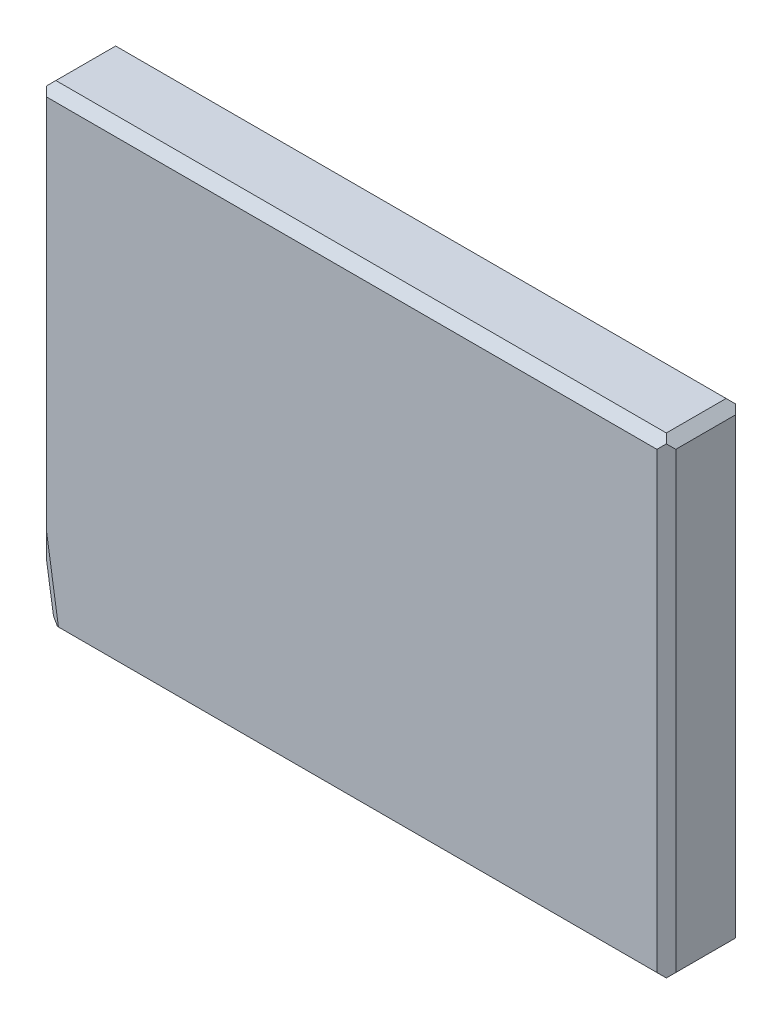
ISO-10303-21;
HEADER;
FILE_DESCRIPTION(('STEP AP214'),'2;1');
FILE_NAME('part.step','',(''),(''),'','','');
FILE_SCHEMA(('AUTOMOTIVE_DESIGN { 1 0 10303 214 1 1 1 1 }'));
ENDSEC;
DATA;
#1=APPLICATION_CONTEXT('core data for automotive mechanical design processes');
#2=APPLICATION_PROTOCOL_DEFINITION('international standard','automotive_design',2000,#1);
#3=PRODUCT_CONTEXT('',#1,'mechanical');
#4=PRODUCT('Part','Part','',(#3));
#5=PRODUCT_RELATED_PRODUCT_CATEGORY('part','',(#4));
#6=PRODUCT_DEFINITION_FORMATION('','',#4);
#7=PRODUCT_DEFINITION_CONTEXT('part definition',#1,'design');
#8=PRODUCT_DEFINITION('design','',#6,#7);
#9=PRODUCT_DEFINITION_SHAPE('','',#8);
#10=(LENGTH_UNIT() NAMED_UNIT(*) SI_UNIT(.MILLI.,.METRE.));
#11=(NAMED_UNIT(*) PLANE_ANGLE_UNIT() SI_UNIT($,.RADIAN.));
#12=(NAMED_UNIT(*) SI_UNIT($,.STERADIAN.) SOLID_ANGLE_UNIT());
#13=UNCERTAINTY_MEASURE_WITH_UNIT(LENGTH_MEASURE(1.E-05),#10,'distance_accuracy_value','');
#14=(GEOMETRIC_REPRESENTATION_CONTEXT(3) GLOBAL_UNCERTAINTY_ASSIGNED_CONTEXT((#13)) GLOBAL_UNIT_ASSIGNED_CONTEXT((#10,
#11,#12)) REPRESENTATION_CONTEXT('',''));
#15=CARTESIAN_POINT('',(0.,0.,0.));
#16=DIRECTION('',(0.,0.,1.));
#17=DIRECTION('',(1.,0.,0.));
#18=AXIS2_PLACEMENT_3D('',#15,#16,#17);
#19=CARTESIAN_POINT('',(0.,0.,12.7));
#20=DIRECTION('',(1.,0.,0.));
#21=DIRECTION('',(0.,0.,-1.));
#22=AXIS2_PLACEMENT_3D('',#19,#20,#21);
#23=PLANE('',#22);
#24=DIRECTION('',(0.,0.,-1.));
#25=VECTOR('',#24,1.);
#26=CARTESIAN_POINT('',(0.,74.676,12.7));
#27=LINE('',#26,#25);
#28=CARTESIAN_POINT('',(0.,74.676,11.176));
#29=VERTEX_POINT('',#28);
#30=CARTESIAN_POINT('',(0.,74.676,1.52399999999998));
#31=VERTEX_POINT('',#30);
#32=EDGE_CURVE('E282',#29,#31,#27,.T.);
#33=ORIENTED_EDGE('',*,*,#32,.T.);
#34=DIRECTION('',(0.,-1.,0.));
#35=VECTOR('',#34,1.);
#36=CARTESIAN_POINT('',(0.,74.1556019661523,1.52399999999998));
#37=LINE('',#36,#35);
#38=CARTESIAN_POINT('',(0.,58.6875531269975,1.52399999999998));
#39=VERTEX_POINT('',#38);
#40=EDGE_CURVE('E370',#31,#39,#37,.T.);
#41=ORIENTED_EDGE('',*,*,#40,.T.);
#42=DIRECTION('',(0.,-0.995181398878501,0.098050922108007));
#43=VECTOR('',#42,1.);
#44=CARTESIAN_POINT('',(0.,9.26744744054077,6.39314942209829));
#45=LINE('',#44,#43);
#46=CARTESIAN_POINT('',(0.,2.86391773399458,7.02406152835393));
#47=VERTEX_POINT('',#46);
#48=EDGE_CURVE('E246',#39,#47,#45,.T.);
#49=ORIENTED_EDGE('',*,*,#48,.T.);
#50=DIRECTION('',(0.,0.816496580927724,0.577350269189629));
#51=VECTOR('',#50,1.);
#52=CARTESIAN_POINT('',(0.,6.08314327930163,9.30039774160953));
#53=LINE('',#52,#51);
#54=CARTESIAN_POINT('',(0.,8.73564543073502,11.176));
#55=VERTEX_POINT('',#54);
#56=EDGE_CURVE('E229',#47,#55,#53,.T.);
#57=ORIENTED_EDGE('',*,*,#56,.T.);
#58=DIRECTION('',(0.,1.,0.));
#59=VECTOR('',#58,1.);
#60=CARTESIAN_POINT('',(0.,0.,11.176));
#61=LINE('',#60,#59);
#62=EDGE_CURVE('E333',#55,#29,#61,.T.);
#63=ORIENTED_EDGE('',*,*,#62,.T.);
#64=EDGE_LOOP('',(#33,#41,#49,#57,#63));
#65=FACE_BOUND('',#64,.T.);
#66=ADVANCED_FACE('F41',(#65),#23,.F.);
#67=CARTESIAN_POINT('',(0.,0.,12.7));
#68=DIRECTION('',(0.,1.,0.));
#69=DIRECTION('',(0.,0.,1.));
#70=AXIS2_PLACEMENT_3D('',#67,#68,#69);
#71=PLANE('',#70);
#72=DIRECTION('',(0.816496580927723,0.,-0.57735026918963));
#73=VECTOR('',#72,1.);
#74=CARTESIAN_POINT('',(6.08314327930157,0.,3.39960225839039));
#75=LINE('',#74,#73);
#76=CARTESIAN_POINT('',(1.91065077872253,0.,6.34999999999987));
#77=VERTEX_POINT('',#76);
#78=CARTESIAN_POINT('',(8.73564543073486,0.,1.52399999999998));
#79=VERTEX_POINT('',#78);
#80=EDGE_CURVE('E450',#77,#79,#75,.T.);
#81=ORIENTED_EDGE('',*,*,#80,.T.);
#82=DIRECTION('',(1.,0.,0.));
#83=VECTOR('',#82,1.);
#84=CARTESIAN_POINT('',(100.076,0.,1.52399999999998));
#85=LINE('',#84,#83);
#86=CARTESIAN_POINT('',(100.076,0.,1.52399999999998));
#87=VERTEX_POINT('',#86);
#88=EDGE_CURVE('E359',#79,#87,#85,.T.);
#89=ORIENTED_EDGE('',*,*,#88,.T.);
#90=DIRECTION('',(0.,0.,1.));
#91=VECTOR('',#90,1.);
#92=CARTESIAN_POINT('',(100.076,0.,12.7));
#93=LINE('',#92,#91);
#94=CARTESIAN_POINT('',(100.076,0.,11.176));
#95=VERTEX_POINT('',#94);
#96=EDGE_CURVE('E272',#87,#95,#93,.T.);
#97=ORIENTED_EDGE('',*,*,#96,.T.);
#98=DIRECTION('',(-1.,0.,0.));
#99=VECTOR('',#98,1.);
#100=CARTESIAN_POINT('',(0.,0.,11.176));
#101=LINE('',#100,#99);
#102=CARTESIAN_POINT('',(8.73564543073516,0.,11.176));
#103=VERTEX_POINT('',#102);
#104=EDGE_CURVE('E317',#95,#103,#101,.T.);
#105=ORIENTED_EDGE('',*,*,#104,.T.);
#106=DIRECTION('',(-0.816496580927721,0.,-0.577350269189633));
#107=VECTOR('',#106,1.);
#108=CARTESIAN_POINT('',(3.92788181024508,0.,7.77639774160943));
#109=LINE('',#108,#107);
#110=EDGE_CURVE('E256',#103,#77,#109,.T.);
#111=ORIENTED_EDGE('',*,*,#110,.T.);
#112=EDGE_LOOP('',(#81,#89,#97,#105,#111));
#113=FACE_BOUND('',#112,.T.);
#114=ADVANCED_FACE('F452',(#113),#71,.F.);
#115=CARTESIAN_POINT('',(101.6,0.,12.7));
#116=DIRECTION('',(-1.,0.,0.));
#117=DIRECTION('',(0.,0.,1.));
#118=AXIS2_PLACEMENT_3D('',#115,#116,#117);
#119=PLANE('',#118);
#120=DIRECTION('',(0.,0.,-1.));
#121=VECTOR('',#120,1.);
#122=CARTESIAN_POINT('',(101.6,1.52399999999998,12.7));
#123=LINE('',#122,#121);
#124=CARTESIAN_POINT('',(101.6,1.52399999999998,11.176));
#125=VERTEX_POINT('',#124);
#126=CARTESIAN_POINT('',(101.6,1.52399999999998,1.52399999999998));
#127=VERTEX_POINT('',#126);
#128=EDGE_CURVE('E271',#125,#127,#123,.T.);
#129=ORIENTED_EDGE('',*,*,#128,.T.);
#130=DIRECTION('',(0.,1.,0.));
#131=VECTOR('',#130,1.);
#132=CARTESIAN_POINT('',(101.6,74.676,1.52399999999998));
#133=LINE('',#132,#131);
#134=CARTESIAN_POINT('',(101.6,74.676,1.52399999999998));
#135=VERTEX_POINT('',#134);
#136=EDGE_CURVE('E346',#127,#135,#133,.T.);
#137=ORIENTED_EDGE('',*,*,#136,.T.);
#138=DIRECTION('',(0.,0.,1.));
#139=VECTOR('',#138,1.);
#140=CARTESIAN_POINT('',(101.6,74.676,12.7));
#141=LINE('',#140,#139);
#142=CARTESIAN_POINT('',(101.6,74.676,11.176));
#143=VERTEX_POINT('',#142);
#144=EDGE_CURVE('E278',#135,#143,#141,.T.);
#145=ORIENTED_EDGE('',*,*,#144,.T.);
#146=DIRECTION('',(0.,-1.,0.));
#147=VECTOR('',#146,1.);
#148=CARTESIAN_POINT('',(101.6,0.,11.176));
#149=LINE('',#148,#147);
#150=EDGE_CURVE('E303',#143,#125,#149,.T.);
#151=ORIENTED_EDGE('',*,*,#150,.T.);
#152=EDGE_LOOP('',(#129,#137,#145,#151));
#153=FACE_BOUND('',#152,.T.);
#154=ADVANCED_FACE('F456',(#153),#119,.F.);
#155=CARTESIAN_POINT('',(0.,76.2,12.7));
#156=DIRECTION('',(0.,-1.,0.));
#157=DIRECTION('',(0.,0.,-1.));
#158=AXIS2_PLACEMENT_3D('',#155,#156,#157);
#159=PLANE('',#158);
#160=DIRECTION('',(0.,0.,-1.));
#161=VECTOR('',#160,1.);
#162=CARTESIAN_POINT('',(100.076,76.2,12.7));
#163=LINE('',#162,#161);
#164=CARTESIAN_POINT('',(100.076,76.2,11.176));
#165=VERTEX_POINT('',#164);
#166=CARTESIAN_POINT('',(100.076,76.2,1.52399999999998));
#167=VERTEX_POINT('',#166);
#168=EDGE_CURVE('E276',#165,#167,#163,.T.);
#169=ORIENTED_EDGE('',*,*,#168,.T.);
#170=DIRECTION('',(-1.,0.,0.));
#171=VECTOR('',#170,1.);
#172=CARTESIAN_POINT('',(1.52400000000001,76.2,1.52399999999998));
#173=LINE('',#172,#171);
#174=CARTESIAN_POINT('',(1.52400000000001,76.2,1.52399999999998));
#175=VERTEX_POINT('',#174);
#176=EDGE_CURVE('E340',#167,#175,#173,.T.);
#177=ORIENTED_EDGE('',*,*,#176,.T.);
#178=DIRECTION('',(0.,0.,1.));
#179=VECTOR('',#178,1.);
#180=CARTESIAN_POINT('',(1.52400000000001,76.2,12.7));
#181=LINE('',#180,#179);
#182=CARTESIAN_POINT('',(1.52400000000001,76.2,11.176));
#183=VERTEX_POINT('',#182);
#184=EDGE_CURVE('E281',#175,#183,#181,.T.);
#185=ORIENTED_EDGE('',*,*,#184,.T.);
#186=DIRECTION('',(1.,0.,0.));
#187=VECTOR('',#186,1.);
#188=CARTESIAN_POINT('',(0.,76.2,11.176));
#189=LINE('',#188,#187);
#190=EDGE_CURVE('E292',#183,#165,#189,.T.);
#191=ORIENTED_EDGE('',*,*,#190,.T.);
#192=EDGE_LOOP('',(#169,#177,#185,#191));
#193=FACE_BOUND('',#192,.T.);
#194=ADVANCED_FACE('F407',(#193),#159,.F.);
#195=CARTESIAN_POINT('',(0.,0.,12.7));
#196=DIRECTION('',(0.,0.,-1.));
#197=DIRECTION('',(-1.,0.,0.));
#198=AXIS2_PLACEMENT_3D('',#195,#196,#197);
#199=PLANE('',#198);
#200=DIRECTION('',(-1.,0.,0.));
#201=VECTOR('',#200,1.);
#202=CARTESIAN_POINT('',(0.,74.676,12.7));
#203=LINE('',#202,#201);
#204=CARTESIAN_POINT('',(100.076,74.676,12.7));
#205=VERTEX_POINT('',#204);
#206=CARTESIAN_POINT('',(1.52399999999998,74.676,12.7));
#207=VERTEX_POINT('',#206);
#208=EDGE_CURVE('E288',#205,#207,#203,.T.);
#209=ORIENTED_EDGE('',*,*,#208,.T.);
#210=DIRECTION('',(0.,-1.,0.));
#211=VECTOR('',#210,1.);
#212=CARTESIAN_POINT('',(1.52399999999998,0.,12.7));
#213=LINE('',#212,#211);
#214=CARTESIAN_POINT('',(1.52399999999998,14.0517458126467,12.7));
#215=VERTEX_POINT('',#214);
#216=EDGE_CURVE('E325',#207,#215,#213,.T.);
#217=ORIENTED_EDGE('',*,*,#216,.T.);
#218=DIRECTION('',(0.15288194975545,-0.988244458339621,0.));
#219=VECTOR('',#218,1.);
#220=CARTESIAN_POINT('',(3.28575695430083,2.66356983887031,12.7));
#221=LINE('',#220,#219);
#222=CARTESIAN_POINT('',(3.46204902189483,1.52399999999998,12.7));
#223=VERTEX_POINT('',#222);
#224=EDGE_CURVE('E245',#215,#223,#221,.T.);
#225=ORIENTED_EDGE('',*,*,#224,.T.);
#226=DIRECTION('',(1.,0.,0.));
#227=VECTOR('',#226,1.);
#228=CARTESIAN_POINT('',(0.,1.52399999999998,12.7));
#229=LINE('',#228,#227);
#230=CARTESIAN_POINT('',(100.076,1.52399999999998,12.7));
#231=VERTEX_POINT('',#230);
#232=EDGE_CURVE('E309',#223,#231,#229,.T.);
#233=ORIENTED_EDGE('',*,*,#232,.T.);
#234=DIRECTION('',(0.,1.,0.));
#235=VECTOR('',#234,1.);
#236=CARTESIAN_POINT('',(100.076,0.,12.7));
#237=LINE('',#236,#235);
#238=EDGE_CURVE('E299',#231,#205,#237,.T.);
#239=ORIENTED_EDGE('',*,*,#238,.T.);
#240=EDGE_LOOP('',(#209,#217,#225,#233,#239));
#241=FACE_BOUND('',#240,.T.);
#242=ADVANCED_FACE('F476',(#241),#199,.F.);
#243=CARTESIAN_POINT('',(0.,0.,0.));
#244=DIRECTION('',(0.,0.,-1.));
#245=DIRECTION('',(-1.,0.,0.));
#246=AXIS2_PLACEMENT_3D('',#243,#244,#245);
#247=PLANE('',#246);
#248=DIRECTION('',(-0.15288194975545,0.988244458339621,0.));
#249=VECTOR('',#248,1.);
#250=CARTESIAN_POINT('',(3.61138407217922,0.558683060260375,0.));
#251=LINE('',#250,#249);
#252=CARTESIAN_POINT('',(3.20239968674056,3.20239968674055,0.));
#253=VERTEX_POINT('',#252);
#254=CARTESIAN_POINT('',(1.524,14.051745812647,0.));
#255=VERTEX_POINT('',#254);
#256=EDGE_CURVE('E203',#253,#255,#251,.T.);
#257=ORIENTED_EDGE('',*,*,#256,.T.);
#258=DIRECTION('',(0.,1.,0.));
#259=VECTOR('',#258,1.);
#260=CARTESIAN_POINT('',(1.524,74.676,0.));
#261=LINE('',#260,#259);
#262=CARTESIAN_POINT('',(1.524,74.676,0.));
#263=VERTEX_POINT('',#262);
#264=EDGE_CURVE('E65',#255,#263,#261,.T.);
#265=ORIENTED_EDGE('',*,*,#264,.T.);
#266=DIRECTION('',(1.,0.,0.));
#267=VECTOR('',#266,1.);
#268=CARTESIAN_POINT('',(100.076,74.676,0.));
#269=LINE('',#268,#267);
#270=CARTESIAN_POINT('',(100.076,74.676,0.));
#271=VERTEX_POINT('',#270);
#272=EDGE_CURVE('E345',#263,#271,#269,.T.);
#273=ORIENTED_EDGE('',*,*,#272,.T.);
#274=DIRECTION('',(0.,-1.,0.));
#275=VECTOR('',#274,1.);
#276=CARTESIAN_POINT('',(100.076,1.52399999999998,0.));
#277=LINE('',#276,#275);
#278=CARTESIAN_POINT('',(100.076,1.524,0.));
#279=VERTEX_POINT('',#278);
#280=EDGE_CURVE('E353',#271,#279,#277,.T.);
#281=ORIENTED_EDGE('',*,*,#280,.T.);
#282=DIRECTION('',(-1.,0.,0.));
#283=VECTOR('',#282,1.);
#284=CARTESIAN_POINT('',(23.9030366741163,1.524,0.));
#285=LINE('',#284,#283);
#286=CARTESIAN_POINT('',(14.0517458126466,1.524,0.));
#287=VERTEX_POINT('',#286);
#288=EDGE_CURVE('E210',#279,#287,#285,.T.);
#289=ORIENTED_EDGE('',*,*,#288,.T.);
#290=DIRECTION('',(-0.988244458339621,0.152881949755455,0.));
#291=VECTOR('',#290,1.);
#292=CARTESIAN_POINT('',(0.558683060260393,3.61138407217922,0.));
#293=LINE('',#292,#291);
#294=EDGE_CURVE('E199',#287,#253,#293,.T.);
#295=ORIENTED_EDGE('',*,*,#294,.T.);
#296=EDGE_LOOP('',(#257,#265,#273,#281,#289,#295));
#297=FACE_BOUND('',#296,.T.);
#298=ADVANCED_FACE('F205',(#297),#247,.T.);
#299=CARTESIAN_POINT('',(1.52399999999998,0.,12.7));
#300=DIRECTION('',(0.707106781186551,0.707106781186544,0.));
#301=DIRECTION('',(0.,0.,-1.));
#302=AXIS2_PLACEMENT_3D('',#299,#300,#301);
#303=PLANE('',#302);
#304=DIRECTION('',(0.589369182353172,-0.589369182353178,-0.55252867236434));
#305=VECTOR('',#304,1.);
#306=CARTESIAN_POINT('',(-0.270497875187257,1.79449787518726,8.87170366595485));
#307=LINE('',#306,#305);
#308=CARTESIAN_POINT('',(0.52935104658601,0.994648953413983,8.12185200069657));
#309=VERTEX_POINT('',#308);
#310=CARTESIAN_POINT('',(1.14371981305447,0.380280186945519,7.54588642760097));
#311=VERTEX_POINT('',#310);
#312=EDGE_CURVE('E239',#309,#311,#307,.T.);
#313=ORIENTED_EDGE('',*,*,#312,.T.);
#314=DIRECTION('',(-0.24304940815067,0.243049408150673,0.939070801588047));
#315=VECTOR('',#314,1.);
#316=CARTESIAN_POINT('',(0.0122704199681247,1.51172958003187,11.9174711872859));
#317=LINE('',#316,#315);
#318=CARTESIAN_POINT('',(0.761999999999977,0.762000000000014,9.02073853094328));
#319=VERTEX_POINT('',#318);
#320=EDGE_CURVE('E264',#311,#319,#317,.T.);
#321=ORIENTED_EDGE('',*,*,#320,.T.);
#322=DIRECTION('',(-0.243049408150673,0.243049408150675,-0.939070801588045));
#323=VECTOR('',#322,1.);
#324=CARTESIAN_POINT('',(1.69178412914953,-0.16778412914955,12.6131485438203));
#325=LINE('',#324,#323);
#326=EDGE_CURVE('E226',#319,#309,#325,.T.);
#327=ORIENTED_EDGE('',*,*,#326,.T.);
#328=EDGE_LOOP('',(#313,#321,#327));
#329=FACE_BOUND('',#328,.T.);
#330=ADVANCED_FACE('F443',(#329),#303,.F.);
#331=CARTESIAN_POINT('',(-2.3565351141156,0.,9.36735608140932));
#332=DIRECTION('',(-0.149429245361346,-0.965925826289067,-0.21132486540519));
#333=DIRECTION('',(-0.816496580927723,0.,0.57735026918963));
#334=AXIS2_PLACEMENT_3D('',#331,#332,#333);
#335=PLANE('',#334);
#336=DIRECTION('',(0.988244458339621,-0.152881949755455,0.));
#337=VECTOR('',#336,1.);
#338=CARTESIAN_POINT('',(-2.09614112407232,1.6832132116109,1.48958180017301));
#339=LINE('',#338,#337);
#340=CARTESIAN_POINT('',(2.7008757405322,0.941112120042212,1.48958180017301));
#341=VERTEX_POINT('',#340);
#342=CARTESIAN_POINT('',(8.56183737463099,0.0344181998269686,1.48958180017301));
#343=VERTEX_POINT('',#342);
#344=EDGE_CURVE('E220',#341,#343,#339,.T.);
#345=ORIENTED_EDGE('',*,*,#344,.T.);
#346=DIRECTION('',(0.962951893139982,-0.190687770318556,0.190687770318554));
#347=VECTOR('',#346,1.);
#348=CARTESIAN_POINT('',(-0.109649496072659,1.75158237853713,-0.227582378537129));
#349=LINE('',#348,#347);
#350=EDGE_CURVE('E369',#343,#79,#349,.T.);
#351=ORIENTED_EDGE('',*,*,#350,.T.);
#352=ORIENTED_EDGE('',*,*,#80,.F.);
#353=DIRECTION('',(0.988244458339621,-0.152881949755453,0.));
#354=VECTOR('',#353,1.);
#355=CARTESIAN_POINT('',(-2.25679864523875,0.644706669555122,6.34999999999991));
#356=LINE('',#355,#354);
#357=CARTESIAN_POINT('',(1.77997866658833,0.0202150460983169,6.34999999999987));
#358=VERTEX_POINT('',#357);
#359=EDGE_CURVE('E259',#77,#358,#356,.F.);
#360=ORIENTED_EDGE('',*,*,#359,.T.);
#361=DIRECTION('',(0.183012701892217,0.183012701892222,-0.965925826289068));
#362=VECTOR('',#361,1.);
#363=CARTESIAN_POINT('',(1.10735641344646,-0.652407207043568,9.90004433533298));
#364=LINE('',#363,#362);
#365=EDGE_CURVE('E236',#358,#341,#364,.T.);
#366=ORIENTED_EDGE('',*,*,#365,.T.);
#367=EDGE_LOOP('',(#345,#351,#352,#360,#366));
#368=FACE_BOUND('',#367,.T.);
#369=ADVANCED_FACE('F430',(#368),#335,.T.);
#370=CARTESIAN_POINT('',(0.,3.63030229993057,7.56597725192399));
#371=DIRECTION('',(0.965925826289069,0.149429245361341,-0.211324865405184));
#372=DIRECTION('',(0.,0.816496580927724,0.577350269189629));
#373=AXIS2_PLACEMENT_3D('',#370,#371,#372);
#374=PLANE('',#373);
#375=DIRECTION('',(0.15288194975545,-0.988244458339622,0.));
#376=VECTOR('',#375,1.);
#377=CARTESIAN_POINT('',(-0.318273115770561,10.8416698774302,11.210418199827));
#378=LINE('',#377,#376);
#379=CARTESIAN_POINT('',(1.17687574053219,1.17687574053222,11.210418199827));
#380=VERTEX_POINT('',#379);
#381=CARTESIAN_POINT('',(0.0344181998269966,8.561837374631,11.210418199827));
#382=VERTEX_POINT('',#381);
#383=EDGE_CURVE('E249',#380,#382,#378,.F.);
#384=ORIENTED_EDGE('',*,*,#383,.T.);
#385=DIRECTION('',(-0.19068777031855,0.962951893139984,-0.190687770318552));
#386=VECTOR('',#385,1.);
#387=CARTESIAN_POINT('',(0.806192166467568,4.66446524105796,11.9821921664676));
#388=LINE('',#387,#386);
#389=EDGE_CURVE('E328',#382,#55,#388,.T.);
#390=ORIENTED_EDGE('',*,*,#389,.T.);
#391=ORIENTED_EDGE('',*,*,#56,.F.);
#392=DIRECTION('',(0.0849104254744814,-0.95426319429159,-0.286656546525899));
#393=VECTOR('',#392,1.);
#394=CARTESIAN_POINT('',(-0.0752880596641531,3.71004026730732,7.27823308688002));
#395=LINE('',#394,#393);
#396=CARTESIAN_POINT('',(0.0532827355008272,2.26510135667123,6.84417967211815));
#397=VERTEX_POINT('',#396);
#398=EDGE_CURVE('E252',#47,#397,#395,.T.);
#399=ORIENTED_EDGE('',*,*,#398,.T.);
#400=DIRECTION('',(0.255451420195527,-0.681706518048025,0.6855806263095));
#401=VECTOR('',#400,1.);
#402=CARTESIAN_POINT('',(-0.061524054213964,2.57147873678067,6.53606116278669));
#403=LINE('',#402,#401);
#404=EDGE_CURVE('E234',#397,#309,#403,.T.);
#405=ORIENTED_EDGE('',*,*,#404,.T.);
#406=ORIENTED_EDGE('',*,*,#326,.F.);
#407=DIRECTION('',(0.183012701892217,0.183012701892216,0.965925826289069));
#408=VECTOR('',#407,1.);
#409=CARTESIAN_POINT('',(0.575379858684716,0.575379858684753,8.03577293927473));
#410=LINE('',#409,#408);
#411=EDGE_CURVE('E266',#319,#380,#410,.T.);
#412=ORIENTED_EDGE('',*,*,#411,.T.);
#413=EDGE_LOOP('',(#384,#390,#391,#399,#405,#406,#412));
#414=FACE_BOUND('',#413,.T.);
#415=ADVANCED_FACE('F448',(#414),#374,.F.);
#416=CARTESIAN_POINT('',(3.61138407217922,0.558683060260375,0.));
#417=DIRECTION('',(0.535340078250002,0.0828173983212655,0.840566641709376));
#418=DIRECTION('',(-0.15288194975545,0.988244458339622,0.));
#419=AXIS2_PLACEMENT_3D('',#416,#417,#418);
#420=PLANE('',#419);
#421=DIRECTION('',(0.,-0.995181398878501,0.098050922108007));
#422=VECTOR('',#421,1.);
#423=CARTESIAN_POINT('',(1.28722619153528,23.8230410175267,-0.811926983633633));
#424=LINE('',#423,#422);
#425=CARTESIAN_POINT('',(1.28722619153528,3.08441661128714,1.23136004783114));
#426=VERTEX_POINT('',#425);
#427=CARTESIAN_POINT('',(1.28722619153528,13.1791072446673,0.236773808464717));
#428=VERTEX_POINT('',#427);
#429=EDGE_CURVE('E258',#426,#428,#424,.F.);
#430=ORIENTED_EDGE('',*,*,#429,.T.);
#431=DIRECTION('',(-0.253321436765084,-0.933625459887715,0.253321436765082));
#432=VECTOR('',#431,1.);
#433=CARTESIAN_POINT('',(-1.53325732962767,2.78411162890566,3.05725732962764));
#434=LINE('',#433,#432);
#435=EDGE_CURVE('E221',#428,#255,#434,.F.);
#436=ORIENTED_EDGE('',*,*,#435,.T.);
#437=ORIENTED_EDGE('',*,*,#256,.F.);
#438=DIRECTION('',(-0.627354361816366,-0.627354361816364,0.461359956454786));
#439=VECTOR('',#438,1.);
#440=CARTESIAN_POINT('',(2.32286830759655,2.32286830759655,0.64681236551484));
#441=LINE('',#440,#439);
#442=CARTESIAN_POINT('',(2.10686444173351,2.10686444173351,0.805662833789429));
#443=VERTEX_POINT('',#442);
#444=EDGE_CURVE('E208',#253,#443,#441,.T.);
#445=ORIENTED_EDGE('',*,*,#444,.T.);
#446=DIRECTION('',(-0.609462467096159,0.726883301050508,0.316537782665797));
#447=VECTOR('',#446,1.);
#448=CARTESIAN_POINT('',(3.5069936388522,0.436982229711662,0.0784748354648877));
#449=LINE('',#448,#447);
#450=EDGE_CURVE('E244',#443,#426,#449,.T.);
#451=ORIENTED_EDGE('',*,*,#450,.T.);
#452=EDGE_LOOP('',(#430,#436,#437,#445,#451));
#453=FACE_BOUND('',#452,.T.);
#454=ADVANCED_FACE('F222',(#453),#420,.F.);
#455=CARTESIAN_POINT('',(0.558683060260394,3.61138407217922,0.));
#456=DIRECTION('',(0.082817398321268,0.535340078250002,0.840566641709376));
#457=DIRECTION('',(-0.988244458339621,0.152881949755455,0.));
#458=AXIS2_PLACEMENT_3D('',#455,#456,#457);
#459=PLANE('',#458);
#460=ORIENTED_EDGE('',*,*,#294,.F.);
#461=DIRECTION('',(0.933625459887712,0.25332143676509,-0.253321436765088));
#462=VECTOR('',#461,1.);
#463=CARTESIAN_POINT('',(2.78411162890572,-1.53325732962764,3.05725732962761));
#464=LINE('',#463,#462);
#465=EDGE_CURVE('E366',#287,#343,#464,.F.);
#466=ORIENTED_EDGE('',*,*,#465,.T.);
#467=ORIENTED_EDGE('',*,*,#344,.F.);
#468=DIRECTION('',(-0.402354618747349,0.789624426162482,-0.463253738657603));
#469=VECTOR('',#468,1.);
#470=CARTESIAN_POINT('',(1.22806172223052,3.83152239460596,-0.206152680146215));
#471=LINE('',#470,#469);
#472=EDGE_CURVE('E216',#341,#443,#471,.T.);
#473=ORIENTED_EDGE('',*,*,#472,.T.);
#474=ORIENTED_EDGE('',*,*,#444,.F.);
#475=EDGE_LOOP('',(#460,#466,#467,#473,#474));
#476=FACE_BOUND('',#475,.T.);
#477=ADVANCED_FACE('F212',(#476),#459,.F.);
#478=CARTESIAN_POINT('',(-0.831120909569602,2.05621913806981,10.0459634624105));
#479=DIRECTION('',(0.792749491079059,0.553603179340959,0.255091678063936));
#480=DIRECTION('',(-0.183012701892217,-0.183012701892222,0.965925826289068));
#481=AXIS2_PLACEMENT_3D('',#478,#479,#480);
#482=PLANE('',#481);
#483=ORIENTED_EDGE('',*,*,#365,.F.);
#484=DIRECTION('',(-0.453936323511096,0.256887028530735,0.853200368477346));
#485=VECTOR('',#484,1.);
#486=CARTESIAN_POINT('',(-0.426920548369312,1.26912100985167,10.4979985757256));
#487=LINE('',#486,#485);
#488=EDGE_CURVE('E265',#358,#311,#487,.T.);
#489=ORIENTED_EDGE('',*,*,#488,.T.);
#490=ORIENTED_EDGE('',*,*,#312,.F.);
#491=ORIENTED_EDGE('',*,*,#404,.F.);
#492=DIRECTION('',(0.212566845867865,0.141140389045727,-0.966899543188334));
#493=VECTOR('',#492,1.);
#494=CARTESIAN_POINT('',(-0.651010721283578,1.79746374325572,10.0477884891708));
#495=LINE('',#494,#493);
#496=EDGE_CURVE('E253',#397,#426,#495,.T.);
#497=ORIENTED_EDGE('',*,*,#496,.T.);
#498=ORIENTED_EDGE('',*,*,#450,.F.);
#499=ORIENTED_EDGE('',*,*,#472,.F.);
#500=EDGE_LOOP('',(#483,#489,#490,#491,#497,#498,#499));
#501=FACE_BOUND('',#500,.T.);
#502=ADVANCED_FACE('F431',(#501),#482,.F.);
#503=CARTESIAN_POINT('',(3.61138407217916,0.558683060260366,12.7));
#504=DIRECTION('',(0.535340078250008,0.0828173983212664,-0.840566641709372));
#505=DIRECTION('',(0.15288194975545,-0.988244458339621,0.));
#506=AXIS2_PLACEMENT_3D('',#503,#504,#505);
#507=PLANE('',#506);
#508=ORIENTED_EDGE('',*,*,#224,.F.);
#509=DIRECTION('',(-0.253321436765082,-0.933625459887715,-0.253321436765084));
#510=VECTOR('',#509,1.);
#511=CARTESIAN_POINT('',(-1.5332573296276,2.7841116289056,9.64274267037239));
#512=LINE('',#511,#510);
#513=EDGE_CURVE('E327',#215,#382,#512,.T.);
#514=ORIENTED_EDGE('',*,*,#513,.T.);
#515=ORIENTED_EDGE('',*,*,#383,.F.);
#516=DIRECTION('',(0.843981200412837,-0.0132527545692967,0.536209005748722));
#517=VECTOR('',#516,1.);
#518=CARTESIAN_POINT('',(3.59201166513918,1.13895166871089,12.7448334596078));
#519=LINE('',#518,#517);
#520=CARTESIAN_POINT('',(2.93170702500053,1.14932021167423,12.3253202116742));
#521=VERTEX_POINT('',#520);
#522=EDGE_CURVE('E268',#380,#521,#519,.T.);
#523=ORIENTED_EDGE('',*,*,#522,.T.);
#524=DIRECTION('',(0.707416681208748,0.499780771512668,0.499780771512673));
#525=VECTOR('',#524,1.);
#526=CARTESIAN_POINT('',(3.19549106380004,1.33568023671447,12.5116802367145));
#527=LINE('',#526,#525);
#528=EDGE_CURVE('E323',#521,#223,#527,.T.);
#529=ORIENTED_EDGE('',*,*,#528,.T.);
#530=EDGE_LOOP('',(#508,#514,#515,#523,#529));
#531=FACE_BOUND('',#530,.T.);
#532=ADVANCED_FACE('F475',(#531),#507,.F.);
#533=CARTESIAN_POINT('',(0.,-0.52631564272545,7.35808657054559));
#534=DIRECTION('',(0.975790873164365,0.0214442930080452,0.217651818615219));
#535=DIRECTION('',(0.,-0.995181398878501,0.098050922108007));
#536=AXIS2_PLACEMENT_3D('',#533,#534,#535);
#537=PLANE('',#536);
#538=ORIENTED_EDGE('',*,*,#48,.F.);
#539=DIRECTION('',(-0.0282628319906739,0.999200893041902,0.0282628319906737));
#540=VECTOR('',#539,1.);
#541=CARTESIAN_POINT('',(1.66755408137786,-0.266960980373084,-0.143554081377865));
#542=LINE('',#541,#540);
#543=EDGE_CURVE('E372',#39,#428,#542,.F.);
#544=ORIENTED_EDGE('',*,*,#543,.T.);
#545=ORIENTED_EDGE('',*,*,#429,.F.);
#546=ORIENTED_EDGE('',*,*,#496,.F.);
#547=ORIENTED_EDGE('',*,*,#398,.F.);
#548=EDGE_LOOP('',(#538,#544,#545,#546,#547));
#549=FACE_BOUND('',#548,.T.);
#550=ADVANCED_FACE('F378',(#549),#537,.F.);
#551=CARTESIAN_POINT('',(3.63030229993066,0.,7.56597725192392));
#552=DIRECTION('',(0.149429245361342,0.965925826289069,-0.211324865405184));
#553=DIRECTION('',(-0.816496580927721,0.,-0.577350269189633));
#554=AXIS2_PLACEMENT_3D('',#551,#552,#553);
#555=PLANE('',#554);
#556=ORIENTED_EDGE('',*,*,#110,.F.);
#557=DIRECTION('',(-0.962951893139984,0.190687770318551,0.190687770318553));
#558=VECTOR('',#557,1.);
#559=CARTESIAN_POINT('',(4.66446524105807,0.806192166467578,11.9821921664676));
#560=LINE('',#559,#558);
#561=EDGE_CURVE('E318',#103,#521,#560,.T.);
#562=ORIENTED_EDGE('',*,*,#561,.T.);
#563=ORIENTED_EDGE('',*,*,#522,.F.);
#564=ORIENTED_EDGE('',*,*,#411,.F.);
#565=ORIENTED_EDGE('',*,*,#320,.F.);
#566=ORIENTED_EDGE('',*,*,#488,.F.);
#567=ORIENTED_EDGE('',*,*,#359,.F.);
#568=EDGE_LOOP('',(#556,#562,#563,#564,#565,#566,#567));
#569=FACE_BOUND('',#568,.T.);
#570=ADVANCED_FACE('F440',(#569),#555,.F.);
#571=CARTESIAN_POINT('',(101.6,1.52399999999998,12.7));
#572=DIRECTION('',(-0.707106781186544,0.707106781186551,0.));
#573=DIRECTION('',(0.,0.,-1.));
#574=AXIS2_PLACEMENT_3D('',#571,#572,#573);
#575=PLANE('',#574);
#576=ORIENTED_EDGE('',*,*,#96,.F.);
#577=DIRECTION('',(-0.577350269189631,-0.577350269189626,0.57735026918962));
#578=VECTOR('',#577,1.);
#579=CARTESIAN_POINT('',(97.3666666666667,-2.70933333333331,4.23333333333326));
#580=LINE('',#579,#578);
#581=CARTESIAN_POINT('',(100.838,0.761999999999997,0.761999999999997));
#582=VERTEX_POINT('',#581);
#583=EDGE_CURVE('E363',#87,#582,#580,.F.);
#584=ORIENTED_EDGE('',*,*,#583,.T.);
#585=DIRECTION('',(-0.577350269189629,-0.577350269189624,-0.577350269189624));
#586=VECTOR('',#585,1.);
#587=CARTESIAN_POINT('',(105.325333333333,5.2493333333333,5.2493333333333));
#588=LINE('',#587,#586);
#589=EDGE_CURVE('E357',#582,#127,#588,.F.);
#590=ORIENTED_EDGE('',*,*,#589,.T.);
#591=ORIENTED_EDGE('',*,*,#128,.F.);
#592=DIRECTION('',(-0.577350269189628,-0.577350269189622,0.577350269189628));
#593=VECTOR('',#592,1.);
#594=CARTESIAN_POINT('',(101.092,1.016,11.684));
#595=LINE('',#594,#593);
#596=CARTESIAN_POINT('',(100.838,0.762000000000006,11.938));
#597=VERTEX_POINT('',#596);
#598=EDGE_CURVE('E307',#125,#597,#595,.T.);
#599=ORIENTED_EDGE('',*,*,#598,.T.);
#600=DIRECTION('',(-0.577350269189628,-0.577350269189622,-0.577350269189628));
#601=VECTOR('',#600,1.);
#602=CARTESIAN_POINT('',(101.6,1.52399999999998,12.7));
#603=LINE('',#602,#601);
#604=EDGE_CURVE('E315',#597,#95,#603,.T.);
#605=ORIENTED_EDGE('',*,*,#604,.T.);
#606=EDGE_LOOP('',(#576,#584,#590,#591,#599,#605));
#607=FACE_BOUND('',#606,.T.);
#608=ADVANCED_FACE('F455',(#607),#575,.F.);
#609=CARTESIAN_POINT('',(100.076,76.2,12.7));
#610=DIRECTION('',(-0.707106781186548,-0.707106781186548,0.));
#611=DIRECTION('',(0.,0.,-1.));
#612=AXIS2_PLACEMENT_3D('',#609,#610,#611);
#613=PLANE('',#612);
#614=ORIENTED_EDGE('',*,*,#144,.F.);
#615=DIRECTION('',(0.577350269189628,-0.577350269189628,0.577350269189622));
#616=VECTOR('',#615,1.);
#617=CARTESIAN_POINT('',(104.309333333333,71.9666666666667,4.2333333333333));
#618=LINE('',#617,#616);
#619=CARTESIAN_POINT('',(100.838,75.438,0.762000000000003));
#620=VERTEX_POINT('',#619);
#621=EDGE_CURVE('E347',#135,#620,#618,.F.);
#622=ORIENTED_EDGE('',*,*,#621,.T.);
#623=DIRECTION('',(0.577350269189628,-0.577350269189628,-0.577350269189622));
#624=VECTOR('',#623,1.);
#625=CARTESIAN_POINT('',(96.3506666666667,79.9253333333333,5.24933333333328));
#626=LINE('',#625,#624);
#627=EDGE_CURVE('E342',#620,#167,#626,.F.);
#628=ORIENTED_EDGE('',*,*,#627,.T.);
#629=ORIENTED_EDGE('',*,*,#168,.F.);
#630=DIRECTION('',(0.577350269189626,-0.577350269189626,0.577350269189626));
#631=VECTOR('',#630,1.);
#632=CARTESIAN_POINT('',(100.584,75.692,11.684));
#633=LINE('',#632,#631);
#634=CARTESIAN_POINT('',(100.838,75.438,11.938));
#635=VERTEX_POINT('',#634);
#636=EDGE_CURVE('E293',#165,#635,#633,.T.);
#637=ORIENTED_EDGE('',*,*,#636,.T.);
#638=DIRECTION('',(0.577350269189626,-0.577350269189626,-0.577350269189626));
#639=VECTOR('',#638,1.);
#640=CARTESIAN_POINT('',(100.076,76.2,12.7));
#641=LINE('',#640,#639);
#642=EDGE_CURVE('E301',#635,#143,#641,.T.);
#643=ORIENTED_EDGE('',*,*,#642,.T.);
#644=EDGE_LOOP('',(#614,#622,#628,#629,#637,#643));
#645=FACE_BOUND('',#644,.T.);
#646=ADVANCED_FACE('F413',(#645),#613,.F.);
#647=CARTESIAN_POINT('',(0.,74.676,12.7));
#648=DIRECTION('',(0.707106781186548,-0.707106781186548,0.));
#649=DIRECTION('',(0.,0.,-1.));
#650=AXIS2_PLACEMENT_3D('',#647,#648,#649);
#651=PLANE('',#650);
#652=DIRECTION('',(0.577350269189628,0.577350269189628,0.577350269189622));
#653=VECTOR('',#652,1.);
#654=CARTESIAN_POINT('',(4.23333333333333,78.9093333333333,4.23333333333327));
#655=LINE('',#654,#653);
#656=CARTESIAN_POINT('',(0.762000000000009,75.438,0.761999999999987));
#657=VERTEX_POINT('',#656);
#658=EDGE_CURVE('E337',#175,#657,#655,.F.);
#659=ORIENTED_EDGE('',*,*,#658,.T.);
#660=DIRECTION('',(0.577350269189628,0.577350269189628,-0.577350269189622));
#661=VECTOR('',#660,1.);
#662=CARTESIAN_POINT('',(-3.72533333333333,70.9506666666666,5.24933333333328));
#663=LINE('',#662,#661);
#664=EDGE_CURVE('E11',#657,#31,#663,.F.);
#665=ORIENTED_EDGE('',*,*,#664,.T.);
#666=ORIENTED_EDGE('',*,*,#32,.F.);
#667=DIRECTION('',(0.577350269189624,0.577350269189624,0.577350269189629));
#668=VECTOR('',#667,1.);
#669=CARTESIAN_POINT('',(0.508000000000001,75.184,11.684));
#670=LINE('',#669,#668);
#671=CARTESIAN_POINT('',(0.761999999999996,75.438,11.938));
#672=VERTEX_POINT('',#671);
#673=EDGE_CURVE('E331',#29,#672,#670,.T.);
#674=ORIENTED_EDGE('',*,*,#673,.T.);
#675=DIRECTION('',(0.577350269189626,0.577350269189626,-0.577350269189626));
#676=VECTOR('',#675,1.);
#677=CARTESIAN_POINT('',(0.,74.676,12.7));
#678=LINE('',#677,#676);
#679=EDGE_CURVE('E290',#672,#183,#678,.T.);
#680=ORIENTED_EDGE('',*,*,#679,.T.);
#681=ORIENTED_EDGE('',*,*,#184,.F.);
#682=EDGE_LOOP('',(#659,#665,#666,#674,#680,#681));
#683=FACE_BOUND('',#682,.T.);
#684=ADVANCED_FACE('F389',(#683),#651,.F.);
#685=CARTESIAN_POINT('',(0.,74.676,12.7));
#686=DIRECTION('',(0.,-0.707106781186548,-0.707106781186548));
#687=DIRECTION('',(-1.,0.,0.));
#688=AXIS2_PLACEMENT_3D('',#685,#686,#687);
#689=PLANE('',#688);
#690=ORIENTED_EDGE('',*,*,#679,.F.);
#691=DIRECTION('',(0.577350269189622,-0.577350269189628,0.577350269189628));
#692=VECTOR('',#691,1.);
#693=CARTESIAN_POINT('',(1.016,75.184,12.192));
#694=LINE('',#693,#692);
#695=EDGE_CURVE('E334',#672,#207,#694,.T.);
#696=ORIENTED_EDGE('',*,*,#695,.T.);
#697=ORIENTED_EDGE('',*,*,#208,.F.);
#698=DIRECTION('',(0.577350269189626,0.577350269189626,-0.577350269189626));
#699=VECTOR('',#698,1.);
#700=CARTESIAN_POINT('',(66.7173333333333,41.3173333333333,46.0586666666667));
#701=LINE('',#700,#699);
#702=EDGE_CURVE('E300',#205,#635,#701,.T.);
#703=ORIENTED_EDGE('',*,*,#702,.T.);
#704=ORIENTED_EDGE('',*,*,#636,.F.);
#705=ORIENTED_EDGE('',*,*,#190,.F.);
#706=EDGE_LOOP('',(#690,#696,#697,#703,#704,#705));
#707=FACE_BOUND('',#706,.T.);
#708=ADVANCED_FACE('F402',(#707),#689,.F.);
#709=CARTESIAN_POINT('',(100.076,0.,12.7));
#710=DIRECTION('',(-0.707106781186548,0.,-0.707106781186548));
#711=DIRECTION('',(0.,1.,0.));
#712=AXIS2_PLACEMENT_3D('',#709,#710,#711);
#713=PLANE('',#712);
#714=ORIENTED_EDGE('',*,*,#238,.F.);
#715=DIRECTION('',(0.577350269189628,-0.577350269189622,-0.577350269189628));
#716=VECTOR('',#715,1.);
#717=CARTESIAN_POINT('',(100.584,1.016,12.192));
#718=LINE('',#717,#716);
#719=EDGE_CURVE('E314',#231,#597,#718,.T.);
#720=ORIENTED_EDGE('',*,*,#719,.T.);
#721=ORIENTED_EDGE('',*,*,#598,.F.);
#722=ORIENTED_EDGE('',*,*,#150,.F.);
#723=ORIENTED_EDGE('',*,*,#642,.F.);
#724=ORIENTED_EDGE('',*,*,#702,.F.);
#725=EDGE_LOOP('',(#714,#720,#721,#722,#723,#724));
#726=FACE_BOUND('',#725,.T.);
#727=ADVANCED_FACE('F465',(#726),#713,.F.);
#728=CARTESIAN_POINT('',(0.,1.52399999999998,12.7));
#729=DIRECTION('',(0.,0.707106781186551,-0.707106781186544));
#730=DIRECTION('',(1.,0.,0.));
#731=AXIS2_PLACEMENT_3D('',#728,#729,#730);
#732=PLANE('',#731);
#733=ORIENTED_EDGE('',*,*,#561,.F.);
#734=ORIENTED_EDGE('',*,*,#104,.F.);
#735=ORIENTED_EDGE('',*,*,#604,.F.);
#736=ORIENTED_EDGE('',*,*,#719,.F.);
#737=ORIENTED_EDGE('',*,*,#232,.F.);
#738=ORIENTED_EDGE('',*,*,#528,.F.);
#739=EDGE_LOOP('',(#733,#734,#735,#736,#737,#738));
#740=FACE_BOUND('',#739,.T.);
#741=ADVANCED_FACE('F468',(#740),#732,.F.);
#742=CARTESIAN_POINT('',(1.52399999999998,0.,12.7));
#743=DIRECTION('',(0.707106781186551,0.,-0.707106781186544));
#744=DIRECTION('',(0.,-1.,0.));
#745=AXIS2_PLACEMENT_3D('',#742,#743,#744);
#746=PLANE('',#745);
#747=ORIENTED_EDGE('',*,*,#673,.F.);
#748=ORIENTED_EDGE('',*,*,#62,.F.);
#749=ORIENTED_EDGE('',*,*,#389,.F.);
#750=ORIENTED_EDGE('',*,*,#513,.F.);
#751=ORIENTED_EDGE('',*,*,#216,.F.);
#752=ORIENTED_EDGE('',*,*,#695,.F.);
#753=EDGE_LOOP('',(#747,#748,#749,#750,#751,#752));
#754=FACE_BOUND('',#753,.T.);
#755=ADVANCED_FACE('F398',(#754),#746,.F.);
#756=CARTESIAN_POINT('',(0.,76.2,1.52399999999998));
#757=DIRECTION('',(0.,0.707106781186544,-0.707106781186551));
#758=DIRECTION('',(1.,0.,0.));
#759=AXIS2_PLACEMENT_3D('',#756,#757,#758);
#760=PLANE('',#759);
#761=ORIENTED_EDGE('',*,*,#272,.F.);
#762=DIRECTION('',(-0.577350269189628,0.577350269189628,0.577350269189622));
#763=VECTOR('',#762,1.);
#764=CARTESIAN_POINT('',(0.,76.2,1.52399999999998));
#765=LINE('',#764,#763);
#766=EDGE_CURVE('E49',#263,#657,#765,.T.);
#767=ORIENTED_EDGE('',*,*,#766,.T.);
#768=ORIENTED_EDGE('',*,*,#658,.F.);
#769=ORIENTED_EDGE('',*,*,#176,.F.);
#770=ORIENTED_EDGE('',*,*,#627,.F.);
#771=DIRECTION('',(-0.577350269189628,-0.577350269189628,-0.577350269189622));
#772=VECTOR('',#771,1.);
#773=CARTESIAN_POINT('',(67.7333333333331,42.3333333333331,-32.3426666666666));
#774=LINE('',#773,#772);
#775=EDGE_CURVE('E351',#620,#271,#774,.T.);
#776=ORIENTED_EDGE('',*,*,#775,.T.);
#777=EDGE_LOOP('',(#761,#767,#768,#769,#770,#776));
#778=FACE_BOUND('',#777,.T.);
#779=ADVANCED_FACE('F412',(#778),#760,.T.);
#780=CARTESIAN_POINT('',(101.6,0.,1.52399999999998));
#781=DIRECTION('',(0.707106781186544,0.,-0.707106781186551));
#782=DIRECTION('',(0.,-1.,0.));
#783=AXIS2_PLACEMENT_3D('',#780,#781,#782);
#784=PLANE('',#783);
#785=ORIENTED_EDGE('',*,*,#589,.F.);
#786=DIRECTION('',(-0.577350269189628,0.577350269189628,-0.577350269189622));
#787=VECTOR('',#786,1.);
#788=CARTESIAN_POINT('',(101.6,0.,1.52399999999998));
#789=LINE('',#788,#787);
#790=EDGE_CURVE('E362',#582,#279,#789,.T.);
#791=ORIENTED_EDGE('',*,*,#790,.T.);
#792=ORIENTED_EDGE('',*,*,#280,.F.);
#793=ORIENTED_EDGE('',*,*,#775,.F.);
#794=ORIENTED_EDGE('',*,*,#621,.F.);
#795=ORIENTED_EDGE('',*,*,#136,.F.);
#796=EDGE_LOOP('',(#785,#791,#792,#793,#794,#795));
#797=FACE_BOUND('',#796,.T.);
#798=ADVANCED_FACE('F417',(#797),#784,.T.);
#799=CARTESIAN_POINT('',(0.,0.,1.52399999999998));
#800=DIRECTION('',(0.,-0.707106781186544,-0.707106781186551));
#801=DIRECTION('',(-1.,0.,0.));
#802=AXIS2_PLACEMENT_3D('',#799,#800,#801);
#803=PLANE('',#802);
#804=ORIENTED_EDGE('',*,*,#465,.F.);
#805=ORIENTED_EDGE('',*,*,#288,.F.);
#806=ORIENTED_EDGE('',*,*,#790,.F.);
#807=ORIENTED_EDGE('',*,*,#583,.F.);
#808=ORIENTED_EDGE('',*,*,#88,.F.);
#809=ORIENTED_EDGE('',*,*,#350,.F.);
#810=EDGE_LOOP('',(#804,#805,#806,#807,#808,#809));
#811=FACE_BOUND('',#810,.T.);
#812=ADVANCED_FACE('F423',(#811),#803,.T.);
#813=CARTESIAN_POINT('',(0.,0.,1.52399999999998));
#814=DIRECTION('',(-0.707106781186544,0.,-0.707106781186551));
#815=DIRECTION('',(0.,1.,0.));
#816=AXIS2_PLACEMENT_3D('',#813,#814,#815);
#817=PLANE('',#816);
#818=ORIENTED_EDGE('',*,*,#766,.F.);
#819=ORIENTED_EDGE('',*,*,#264,.F.);
#820=ORIENTED_EDGE('',*,*,#435,.F.);
#821=ORIENTED_EDGE('',*,*,#543,.F.);
#822=ORIENTED_EDGE('',*,*,#40,.F.);
#823=ORIENTED_EDGE('',*,*,#664,.F.);
#824=EDGE_LOOP('',(#818,#819,#820,#821,#822,#823));
#825=FACE_BOUND('',#824,.T.);
#826=ADVANCED_FACE('F42',(#825),#817,.T.);
#827=CLOSED_SHELL('',(#66,#114,#154,#194,#242,#298,#330,#369,#415,#454,#477,#502,#532,#550,#570,
#608,#646,#684,#708,#727,#741,#755,#779,#798,#812,#826));
#828=MANIFOLD_SOLID_BREP('B2',#827);
#829=ADVANCED_BREP_SHAPE_REPRESENTATION('',(#18,#828),#14);
#830=SHAPE_DEFINITION_REPRESENTATION(#9,#829);
ENDSEC;
END-ISO-10303-21;
